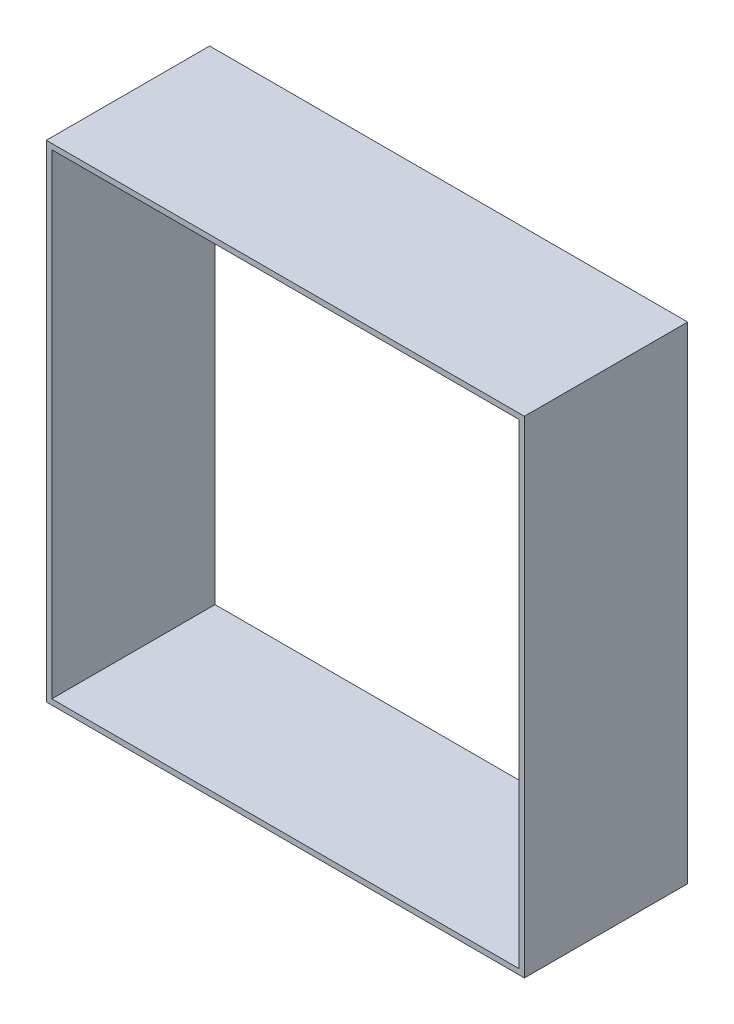
ISO-10303-21;
HEADER;
FILE_DESCRIPTION(('STEP AP214'),'2;1');
FILE_NAME('part.step','',(''),(''),'','','');
FILE_SCHEMA(('AUTOMOTIVE_DESIGN { 1 0 10303 214 1 1 1 1 }'));
ENDSEC;
DATA;
#1=APPLICATION_CONTEXT('core data for automotive mechanical design processes');
#2=APPLICATION_PROTOCOL_DEFINITION('international standard','automotive_design',2000,#1);
#3=PRODUCT_CONTEXT('',#1,'mechanical');
#4=PRODUCT('Part','Part','',(#3));
#5=PRODUCT_RELATED_PRODUCT_CATEGORY('part','',(#4));
#6=PRODUCT_DEFINITION_FORMATION('','',#4);
#7=PRODUCT_DEFINITION_CONTEXT('part definition',#1,'design');
#8=PRODUCT_DEFINITION('design','',#6,#7);
#9=PRODUCT_DEFINITION_SHAPE('','',#8);
#10=(LENGTH_UNIT() NAMED_UNIT(*) SI_UNIT(.MILLI.,.METRE.));
#11=(NAMED_UNIT(*) PLANE_ANGLE_UNIT() SI_UNIT($,.RADIAN.));
#12=(NAMED_UNIT(*) SI_UNIT($,.STERADIAN.) SOLID_ANGLE_UNIT());
#13=UNCERTAINTY_MEASURE_WITH_UNIT(LENGTH_MEASURE(1.E-05),#10,'distance_accuracy_value','');
#14=(GEOMETRIC_REPRESENTATION_CONTEXT(3) GLOBAL_UNCERTAINTY_ASSIGNED_CONTEXT((#13)) GLOBAL_UNIT_ASSIGNED_CONTEXT((#10,
#11,#12)) REPRESENTATION_CONTEXT('',''));
#15=CARTESIAN_POINT('',(0.,0.,0.));
#16=DIRECTION('',(0.,0.,1.));
#17=DIRECTION('',(1.,0.,0.));
#18=AXIS2_PLACEMENT_3D('',#15,#16,#17);
#19=CARTESIAN_POINT('',(0.,0.,15.));
#20=DIRECTION('',(0.,0.,1.));
#21=DIRECTION('',(1.,0.,0.));
#22=AXIS2_PLACEMENT_3D('',#19,#20,#21);
#23=PLANE('',#22);
#24=DIRECTION('',(0.,1.,0.));
#25=VECTOR('',#24,1.);
#26=CARTESIAN_POINT('',(43.925,44.7,15.));
#27=LINE('',#26,#25);
#28=CARTESIAN_POINT('',(43.925,-44.7,15.));
#29=VERTEX_POINT('',#28);
#30=CARTESIAN_POINT('',(43.925,44.7,15.));
#31=VERTEX_POINT('',#30);
#32=EDGE_CURVE('E152',#29,#31,#27,.T.);
#33=ORIENTED_EDGE('',*,*,#32,.T.);
#34=DIRECTION('',(-1.,0.,0.));
#35=VECTOR('',#34,1.);
#36=CARTESIAN_POINT('',(-43.925,44.7,15.));
#37=LINE('',#36,#35);
#38=CARTESIAN_POINT('',(-43.925,44.7,15.));
#39=VERTEX_POINT('',#38);
#40=EDGE_CURVE('E156',#31,#39,#37,.T.);
#41=ORIENTED_EDGE('',*,*,#40,.T.);
#42=DIRECTION('',(0.,-1.,0.));
#43=VECTOR('',#42,1.);
#44=CARTESIAN_POINT('',(-43.925,44.7,15.));
#45=LINE('',#44,#43);
#46=CARTESIAN_POINT('',(-43.925,-44.7,15.));
#47=VERTEX_POINT('',#46);
#48=EDGE_CURVE('E159',#39,#47,#45,.T.);
#49=ORIENTED_EDGE('',*,*,#48,.T.);
#50=DIRECTION('',(1.,0.,0.));
#51=VECTOR('',#50,1.);
#52=CARTESIAN_POINT('',(-43.925,-44.7,15.));
#53=LINE('',#52,#51);
#54=EDGE_CURVE('E162',#47,#29,#53,.T.);
#55=ORIENTED_EDGE('',*,*,#54,.T.);
#56=EDGE_LOOP('',(#33,#41,#49,#55));
#57=FACE_BOUND('',#56,.T.);
#58=DIRECTION('',(1.,0.,0.));
#59=VECTOR('',#58,1.);
#60=CARTESIAN_POINT('',(42.925,-43.7,15.));
#61=LINE('',#60,#59);
#62=CARTESIAN_POINT('',(-42.925,-43.7,15.));
#63=VERTEX_POINT('',#62);
#64=CARTESIAN_POINT('',(42.925,-43.7,15.));
#65=VERTEX_POINT('',#64);
#66=EDGE_CURVE('E111',#63,#65,#61,.T.);
#67=ORIENTED_EDGE('',*,*,#66,.F.);
#68=DIRECTION('',(0.,-1.,0.));
#69=VECTOR('',#68,1.);
#70=CARTESIAN_POINT('',(-42.925,-43.7,15.));
#71=LINE('',#70,#69);
#72=CARTESIAN_POINT('',(-42.925,43.7,15.));
#73=VERTEX_POINT('',#72);
#74=EDGE_CURVE('E102',#73,#63,#71,.T.);
#75=ORIENTED_EDGE('',*,*,#74,.F.);
#76=DIRECTION('',(-1.,0.,0.));
#77=VECTOR('',#76,1.);
#78=CARTESIAN_POINT('',(42.925,43.7,15.));
#79=LINE('',#78,#77);
#80=CARTESIAN_POINT('',(42.925,43.7,15.));
#81=VERTEX_POINT('',#80);
#82=EDGE_CURVE('E130',#81,#73,#79,.T.);
#83=ORIENTED_EDGE('',*,*,#82,.F.);
#84=DIRECTION('',(0.,1.,0.));
#85=VECTOR('',#84,1.);
#86=CARTESIAN_POINT('',(42.925,-43.7,15.));
#87=LINE('',#86,#85);
#88=EDGE_CURVE('E124',#65,#81,#87,.T.);
#89=ORIENTED_EDGE('',*,*,#88,.F.);
#90=EDGE_LOOP('',(#67,#75,#83,#89));
#91=FACE_BOUND('',#90,.T.);
#92=ADVANCED_FACE('F36',(#57,#91),#23,.T.);
#93=CARTESIAN_POINT('',(0.,0.,-15.));
#94=DIRECTION('',(0.,0.,1.));
#95=DIRECTION('',(1.,0.,0.));
#96=AXIS2_PLACEMENT_3D('',#93,#94,#95);
#97=PLANE('',#96);
#98=DIRECTION('',(0.,1.,0.));
#99=VECTOR('',#98,1.);
#100=CARTESIAN_POINT('',(43.925,44.7,-15.));
#101=LINE('',#100,#99);
#102=CARTESIAN_POINT('',(43.925,-44.7,-15.));
#103=VERTEX_POINT('',#102);
#104=CARTESIAN_POINT('',(43.925,44.7,-15.));
#105=VERTEX_POINT('',#104);
#106=EDGE_CURVE('E120',#103,#105,#101,.T.);
#107=ORIENTED_EDGE('',*,*,#106,.F.);
#108=DIRECTION('',(1.,0.,0.));
#109=VECTOR('',#108,1.);
#110=CARTESIAN_POINT('',(-43.925,-44.7,-15.));
#111=LINE('',#110,#109);
#112=CARTESIAN_POINT('',(-43.925,-44.7,-15.));
#113=VERTEX_POINT('',#112);
#114=EDGE_CURVE('E157',#113,#103,#111,.T.);
#115=ORIENTED_EDGE('',*,*,#114,.F.);
#116=DIRECTION('',(0.,-1.,0.));
#117=VECTOR('',#116,1.);
#118=CARTESIAN_POINT('',(-43.925,44.7,-15.));
#119=LINE('',#118,#117);
#120=CARTESIAN_POINT('',(-43.925,44.7,-15.));
#121=VERTEX_POINT('',#120);
#122=EDGE_CURVE('E172',#121,#113,#119,.T.);
#123=ORIENTED_EDGE('',*,*,#122,.F.);
#124=DIRECTION('',(-1.,0.,0.));
#125=VECTOR('',#124,1.);
#126=CARTESIAN_POINT('',(-43.925,44.7,-15.));
#127=LINE('',#126,#125);
#128=EDGE_CURVE('E169',#105,#121,#127,.T.);
#129=ORIENTED_EDGE('',*,*,#128,.F.);
#130=EDGE_LOOP('',(#107,#115,#123,#129));
#131=FACE_BOUND('',#130,.T.);
#132=DIRECTION('',(0.,-1.,0.));
#133=VECTOR('',#132,1.);
#134=CARTESIAN_POINT('',(-42.925,-43.7,-15.));
#135=LINE('',#134,#133);
#136=CARTESIAN_POINT('',(-42.925,43.7,-15.));
#137=VERTEX_POINT('',#136);
#138=CARTESIAN_POINT('',(-42.925,-43.7,-15.));
#139=VERTEX_POINT('',#138);
#140=EDGE_CURVE('E60',#137,#139,#135,.T.);
#141=ORIENTED_EDGE('',*,*,#140,.T.);
#142=DIRECTION('',(1.,0.,0.));
#143=VECTOR('',#142,1.);
#144=CARTESIAN_POINT('',(42.925,-43.7,-15.));
#145=LINE('',#144,#143);
#146=CARTESIAN_POINT('',(42.925,-43.7,-15.));
#147=VERTEX_POINT('',#146);
#148=EDGE_CURVE('E118',#139,#147,#145,.T.);
#149=ORIENTED_EDGE('',*,*,#148,.T.);
#150=DIRECTION('',(0.,1.,0.));
#151=VECTOR('',#150,1.);
#152=CARTESIAN_POINT('',(42.925,-43.7,-15.));
#153=LINE('',#152,#151);
#154=CARTESIAN_POINT('',(42.925,43.7,-15.));
#155=VERTEX_POINT('',#154);
#156=EDGE_CURVE('E139',#147,#155,#153,.T.);
#157=ORIENTED_EDGE('',*,*,#156,.T.);
#158=DIRECTION('',(-1.,0.,0.));
#159=VECTOR('',#158,1.);
#160=CARTESIAN_POINT('',(42.925,43.7,-15.));
#161=LINE('',#160,#159);
#162=EDGE_CURVE('E112',#155,#137,#161,.T.);
#163=ORIENTED_EDGE('',*,*,#162,.T.);
#164=EDGE_LOOP('',(#141,#149,#157,#163));
#165=FACE_BOUND('',#164,.T.);
#166=ADVANCED_FACE('F194',(#131,#165),#97,.F.);
#167=CARTESIAN_POINT('',(43.925,44.7,15.));
#168=DIRECTION('',(-1.,0.,0.));
#169=DIRECTION('',(0.,0.,1.));
#170=AXIS2_PLACEMENT_3D('',#167,#168,#169);
#171=PLANE('',#170);
#172=ORIENTED_EDGE('',*,*,#106,.T.);
#173=DIRECTION('',(0.,0.,-1.));
#174=VECTOR('',#173,1.);
#175=CARTESIAN_POINT('',(43.925,44.7,15.));
#176=LINE('',#175,#174);
#177=EDGE_CURVE('E11',#31,#105,#176,.T.);
#178=ORIENTED_EDGE('',*,*,#177,.F.);
#179=ORIENTED_EDGE('',*,*,#32,.F.);
#180=DIRECTION('',(0.,0.,-1.));
#181=VECTOR('',#180,1.);
#182=CARTESIAN_POINT('',(43.925,-44.7,15.));
#183=LINE('',#182,#181);
#184=EDGE_CURVE('E165',#29,#103,#183,.T.);
#185=ORIENTED_EDGE('',*,*,#184,.T.);
#186=EDGE_LOOP('',(#172,#178,#179,#185));
#187=FACE_BOUND('',#186,.T.);
#188=ADVANCED_FACE('F38',(#187),#171,.F.);
#189=CARTESIAN_POINT('',(-43.925,44.7,15.));
#190=DIRECTION('',(0.,-1.,0.));
#191=DIRECTION('',(0.,0.,-1.));
#192=AXIS2_PLACEMENT_3D('',#189,#190,#191);
#193=PLANE('',#192);
#194=ORIENTED_EDGE('',*,*,#128,.T.);
#195=DIRECTION('',(0.,0.,-1.));
#196=VECTOR('',#195,1.);
#197=CARTESIAN_POINT('',(-43.925,44.7,15.));
#198=LINE('',#197,#196);
#199=EDGE_CURVE('E45',#39,#121,#198,.T.);
#200=ORIENTED_EDGE('',*,*,#199,.F.);
#201=ORIENTED_EDGE('',*,*,#40,.F.);
#202=ORIENTED_EDGE('',*,*,#177,.T.);
#203=EDGE_LOOP('',(#194,#200,#201,#202));
#204=FACE_BOUND('',#203,.T.);
#205=ADVANCED_FACE('F204',(#204),#193,.F.);
#206=CARTESIAN_POINT('',(-43.925,44.7,15.));
#207=DIRECTION('',(1.,0.,0.));
#208=DIRECTION('',(0.,0.,-1.));
#209=AXIS2_PLACEMENT_3D('',#206,#207,#208);
#210=PLANE('',#209);
#211=ORIENTED_EDGE('',*,*,#122,.T.);
#212=DIRECTION('',(0.,0.,-1.));
#213=VECTOR('',#212,1.);
#214=CARTESIAN_POINT('',(-43.925,-44.7,15.));
#215=LINE('',#214,#213);
#216=EDGE_CURVE('E179',#47,#113,#215,.T.);
#217=ORIENTED_EDGE('',*,*,#216,.F.);
#218=ORIENTED_EDGE('',*,*,#48,.F.);
#219=ORIENTED_EDGE('',*,*,#199,.T.);
#220=EDGE_LOOP('',(#211,#217,#218,#219));
#221=FACE_BOUND('',#220,.T.);
#222=ADVANCED_FACE('F188',(#221),#210,.F.);
#223=CARTESIAN_POINT('',(-43.925,-44.7,15.));
#224=DIRECTION('',(0.,1.,0.));
#225=DIRECTION('',(0.,0.,1.));
#226=AXIS2_PLACEMENT_3D('',#223,#224,#225);
#227=PLANE('',#226);
#228=ORIENTED_EDGE('',*,*,#114,.T.);
#229=ORIENTED_EDGE('',*,*,#184,.F.);
#230=ORIENTED_EDGE('',*,*,#54,.F.);
#231=ORIENTED_EDGE('',*,*,#216,.T.);
#232=EDGE_LOOP('',(#228,#229,#230,#231));
#233=FACE_BOUND('',#232,.T.);
#234=ADVANCED_FACE('F198',(#233),#227,.F.);
#235=CARTESIAN_POINT('',(-42.925,-43.7,15.));
#236=DIRECTION('',(1.,0.,0.));
#237=DIRECTION('',(0.,0.,-1.));
#238=AXIS2_PLACEMENT_3D('',#235,#236,#237);
#239=PLANE('',#238);
#240=ORIENTED_EDGE('',*,*,#140,.F.);
#241=DIRECTION('',(0.,0.,-1.));
#242=VECTOR('',#241,1.);
#243=CARTESIAN_POINT('',(-42.925,43.7,15.));
#244=LINE('',#243,#242);
#245=EDGE_CURVE('E106',#73,#137,#244,.T.);
#246=ORIENTED_EDGE('',*,*,#245,.F.);
#247=ORIENTED_EDGE('',*,*,#74,.T.);
#248=DIRECTION('',(0.,0.,-1.));
#249=VECTOR('',#248,1.);
#250=CARTESIAN_POINT('',(-42.925,-43.7,15.));
#251=LINE('',#250,#249);
#252=EDGE_CURVE('E105',#63,#139,#251,.T.);
#253=ORIENTED_EDGE('',*,*,#252,.T.);
#254=EDGE_LOOP('',(#240,#246,#247,#253));
#255=FACE_BOUND('',#254,.T.);
#256=ADVANCED_FACE('F104',(#255),#239,.T.);
#257=CARTESIAN_POINT('',(42.925,-43.7,15.));
#258=DIRECTION('',(0.,1.,0.));
#259=DIRECTION('',(0.,0.,1.));
#260=AXIS2_PLACEMENT_3D('',#257,#258,#259);
#261=PLANE('',#260);
#262=ORIENTED_EDGE('',*,*,#148,.F.);
#263=ORIENTED_EDGE('',*,*,#252,.F.);
#264=ORIENTED_EDGE('',*,*,#66,.T.);
#265=DIRECTION('',(0.,0.,-1.));
#266=VECTOR('',#265,1.);
#267=CARTESIAN_POINT('',(42.925,-43.7,15.));
#268=LINE('',#267,#266);
#269=EDGE_CURVE('E121',#65,#147,#268,.T.);
#270=ORIENTED_EDGE('',*,*,#269,.T.);
#271=EDGE_LOOP('',(#262,#263,#264,#270));
#272=FACE_BOUND('',#271,.T.);
#273=ADVANCED_FACE('F115',(#272),#261,.T.);
#274=CARTESIAN_POINT('',(42.925,-43.7,15.));
#275=DIRECTION('',(-1.,0.,0.));
#276=DIRECTION('',(0.,0.,1.));
#277=AXIS2_PLACEMENT_3D('',#274,#275,#276);
#278=PLANE('',#277);
#279=ORIENTED_EDGE('',*,*,#156,.F.);
#280=ORIENTED_EDGE('',*,*,#269,.F.);
#281=ORIENTED_EDGE('',*,*,#88,.T.);
#282=DIRECTION('',(0.,0.,-1.));
#283=VECTOR('',#282,1.);
#284=CARTESIAN_POINT('',(42.925,43.7,15.));
#285=LINE('',#284,#283);
#286=EDGE_CURVE('E52',#81,#155,#285,.T.);
#287=ORIENTED_EDGE('',*,*,#286,.T.);
#288=EDGE_LOOP('',(#279,#280,#281,#287));
#289=FACE_BOUND('',#288,.T.);
#290=ADVANCED_FACE('F227',(#289),#278,.T.);
#291=CARTESIAN_POINT('',(42.925,43.7,15.));
#292=DIRECTION('',(0.,-1.,0.));
#293=DIRECTION('',(0.,0.,-1.));
#294=AXIS2_PLACEMENT_3D('',#291,#292,#293);
#295=PLANE('',#294);
#296=ORIENTED_EDGE('',*,*,#162,.F.);
#297=ORIENTED_EDGE('',*,*,#286,.F.);
#298=ORIENTED_EDGE('',*,*,#82,.T.);
#299=ORIENTED_EDGE('',*,*,#245,.T.);
#300=EDGE_LOOP('',(#296,#297,#298,#299));
#301=FACE_BOUND('',#300,.T.);
#302=ADVANCED_FACE('F231',(#301),#295,.T.);
#303=CLOSED_SHELL('',(#92,#166,#188,#205,#222,#234,#256,#273,#290,#302));
#304=MANIFOLD_SOLID_BREP('B2',#303);
#305=ADVANCED_BREP_SHAPE_REPRESENTATION('',(#18,#304),#14);
#306=SHAPE_DEFINITION_REPRESENTATION(#9,#305);
ENDSEC;
END-ISO-10303-21;
